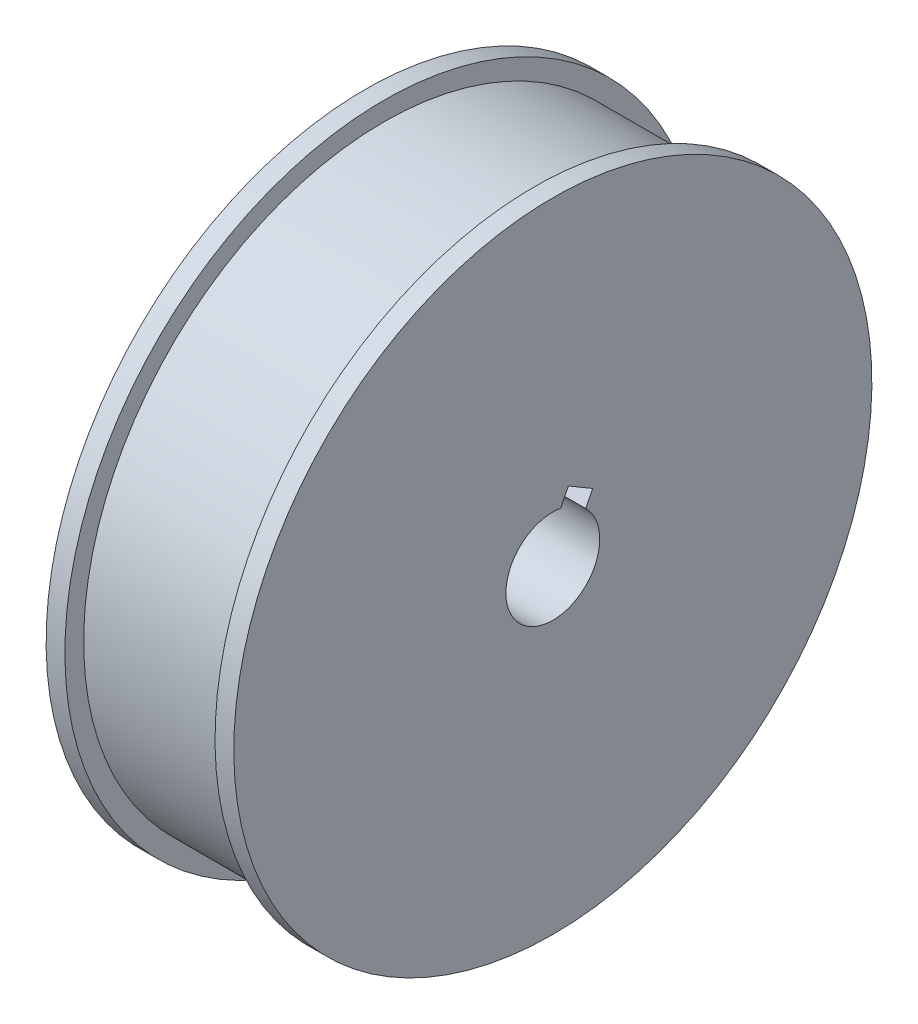
ISO-10303-21;
HEADER;
FILE_DESCRIPTION(('STEP AP214'),'2;1');
FILE_NAME('part.step','',(''),(''),'','','');
FILE_SCHEMA(('AUTOMOTIVE_DESIGN { 1 0 10303 214 1 1 1 1 }'));
ENDSEC;
DATA;
#1=APPLICATION_CONTEXT('core data for automotive mechanical design processes');
#2=APPLICATION_PROTOCOL_DEFINITION('international standard','automotive_design',2000,#1);
#3=PRODUCT_CONTEXT('',#1,'mechanical');
#4=PRODUCT('Part','Part','',(#3));
#5=PRODUCT_RELATED_PRODUCT_CATEGORY('part','',(#4));
#6=PRODUCT_DEFINITION_FORMATION('','',#4);
#7=PRODUCT_DEFINITION_CONTEXT('part definition',#1,'design');
#8=PRODUCT_DEFINITION('design','',#6,#7);
#9=PRODUCT_DEFINITION_SHAPE('','',#8);
#10=(LENGTH_UNIT() NAMED_UNIT(*) SI_UNIT(.MILLI.,.METRE.));
#11=(NAMED_UNIT(*) PLANE_ANGLE_UNIT() SI_UNIT($,.RADIAN.));
#12=(NAMED_UNIT(*) SI_UNIT($,.STERADIAN.) SOLID_ANGLE_UNIT());
#13=UNCERTAINTY_MEASURE_WITH_UNIT(LENGTH_MEASURE(1.E-05),#10,'distance_accuracy_value','');
#14=(GEOMETRIC_REPRESENTATION_CONTEXT(3) GLOBAL_UNCERTAINTY_ASSIGNED_CONTEXT((#13)) GLOBAL_UNIT_ASSIGNED_CONTEXT((#10,
#11,#12)) REPRESENTATION_CONTEXT('',''));
#15=CARTESIAN_POINT('',(0.,0.,0.));
#16=DIRECTION('',(0.,0.,1.));
#17=DIRECTION('',(1.,0.,0.));
#18=AXIS2_PLACEMENT_3D('',#15,#16,#17);
#19=CARTESIAN_POINT('',(15.875,0.,0.));
#20=DIRECTION('',(-1.,0.,0.));
#21=DIRECTION('',(0.,-1.,0.));
#22=AXIS2_PLACEMENT_3D('',#19,#20,#21);
#23=PLANE('',#22);
#24=DIRECTION('',(0.,0.891213934482908,-0.453583204035923));
#25=VECTOR('',#24,1.);
#26=CARTESIAN_POINT('',(15.875,7.82827103191582,-1.31228003901958));
#27=LINE('',#26,#25);
#28=CARTESIAN_POINT('',(15.875,7.82827103191678,-1.31228003901973));
#29=VERTEX_POINT('',#28);
#30=CARTESIAN_POINT('',(15.875,10.4223950616676,-2.63255909161775));
#31=VERTEX_POINT('',#30);
#32=EDGE_CURVE('E101',#29,#31,#27,.T.);
#33=ORIENTED_EDGE('',*,*,#32,.T.);
#34=DIRECTION('',(0.,-0.506856941129746,-0.862030185798965));
#35=VECTOR('',#34,1.);
#36=CARTESIAN_POINT('',(15.875,10.4223950616676,-2.63255909161775));
#37=LINE('',#36,#35);
#38=CARTESIAN_POINT('',(15.875,8.00402725423075,-6.74556590124801));
#39=VERTEX_POINT('',#38);
#40=EDGE_CURVE('E94',#31,#39,#37,.T.);
#41=ORIENTED_EDGE('',*,*,#40,.T.);
#42=DIRECTION('',(0.,-0.89121393448289,0.453583204035961));
#43=VECTOR('',#42,1.);
#44=CARTESIAN_POINT('',(15.875,8.00402725423075,-6.74556590124801));
#45=LINE('',#44,#43);
#46=CARTESIAN_POINT('',(15.875,5.66808102269639,-5.55668640199527));
#47=VERTEX_POINT('',#46);
#48=EDGE_CURVE('E104',#39,#47,#45,.T.);
#49=ORIENTED_EDGE('',*,*,#48,.T.);
#50=CARTESIAN_POINT('',(15.875,-5.26818817299221E-13,5.33663995873788E-13));
#51=DIRECTION('',(-1.,0.,0.));
#52=DIRECTION('',(0.,-1.,0.));
#53=AXIS2_PLACEMENT_3D('',#50,#51,#52);
#54=CIRCLE('',#53,7.9374999999979);
#55=EDGE_CURVE('E61',#47,#29,#54,.T.);
#56=ORIENTED_EDGE('',*,*,#55,.T.);
#57=EDGE_LOOP('',(#33,#41,#49,#56));
#58=FACE_BOUND('',#57,.T.);
#59=CARTESIAN_POINT('',(15.875,0.,0.));
#60=DIRECTION('',(-1.,0.,0.));
#61=DIRECTION('',(0.,-1.,0.));
#62=AXIS2_PLACEMENT_3D('',#59,#60,#61);
#63=CIRCLE('',#62,53.975);
#64=CARTESIAN_POINT('',(15.875,-53.975,0.));
#65=VERTEX_POINT('',#64);
#66=EDGE_CURVE('E11',#65,#65,#63,.T.);
#67=ORIENTED_EDGE('',*,*,#66,.F.);
#68=EDGE_LOOP('',(#67));
#69=FACE_BOUND('',#68,.T.);
#70=ADVANCED_FACE('F43',(#58,#69),#23,.F.);
#71=CARTESIAN_POINT('',(-15.875,0.,0.));
#72=DIRECTION('',(-1.,0.,0.));
#73=DIRECTION('',(0.,-1.,0.));
#74=AXIS2_PLACEMENT_3D('',#71,#72,#73);
#75=CYLINDRICAL_SURFACE('',#74,53.975);
#76=CARTESIAN_POINT('',(12.7,0.,0.));
#77=DIRECTION('',(-1.,0.,0.));
#78=DIRECTION('',(0.,-1.,0.));
#79=AXIS2_PLACEMENT_3D('',#76,#77,#78);
#80=CIRCLE('',#79,53.975);
#81=CARTESIAN_POINT('',(12.7,-53.975,0.));
#82=VERTEX_POINT('',#81);
#83=EDGE_CURVE('E51',#82,#82,#80,.T.);
#84=ORIENTED_EDGE('',*,*,#83,.F.);
#85=EDGE_LOOP('',(#84));
#86=FACE_BOUND('',#85,.T.);
#87=ORIENTED_EDGE('',*,*,#66,.T.);
#88=EDGE_LOOP('',(#87));
#89=FACE_BOUND('',#88,.T.);
#90=ADVANCED_FACE('F161',(#86,#89),#75,.T.);
#91=CARTESIAN_POINT('',(12.7,0.,0.));
#92=DIRECTION('',(-1.,0.,0.));
#93=DIRECTION('',(0.,-1.,0.));
#94=AXIS2_PLACEMENT_3D('',#91,#92,#93);
#95=PLANE('',#94);
#96=ORIENTED_EDGE('',*,*,#83,.T.);
#97=EDGE_LOOP('',(#96));
#98=FACE_BOUND('',#97,.T.);
#99=CARTESIAN_POINT('',(12.7,0.,0.));
#100=DIRECTION('',(-1.,0.,0.));
#101=DIRECTION('',(0.,-1.,0.));
#102=AXIS2_PLACEMENT_3D('',#99,#100,#101);
#103=CIRCLE('',#102,50.8);
#104=CARTESIAN_POINT('',(12.7,-50.8,0.));
#105=VERTEX_POINT('',#104);
#106=EDGE_CURVE('E151',#105,#105,#103,.T.);
#107=ORIENTED_EDGE('',*,*,#106,.F.);
#108=EDGE_LOOP('',(#107));
#109=FACE_BOUND('',#108,.T.);
#110=ADVANCED_FACE('F158',(#98,#109),#95,.T.);
#111=CARTESIAN_POINT('',(-15.875,0.,0.));
#112=DIRECTION('',(-1.,0.,0.));
#113=DIRECTION('',(0.,-1.,0.));
#114=AXIS2_PLACEMENT_3D('',#111,#112,#113);
#115=CYLINDRICAL_SURFACE('',#114,50.8);
#116=ORIENTED_EDGE('',*,*,#106,.T.);
#117=EDGE_LOOP('',(#116));
#118=FACE_BOUND('',#117,.T.);
#119=CARTESIAN_POINT('',(-12.7,0.,0.));
#120=DIRECTION('',(-1.,0.,0.));
#121=DIRECTION('',(0.,-1.,0.));
#122=AXIS2_PLACEMENT_3D('',#119,#120,#121);
#123=CIRCLE('',#122,50.8);
#124=CARTESIAN_POINT('',(-12.7,-50.8,0.));
#125=VERTEX_POINT('',#124);
#126=EDGE_CURVE('E147',#125,#125,#123,.T.);
#127=ORIENTED_EDGE('',*,*,#126,.F.);
#128=EDGE_LOOP('',(#127));
#129=FACE_BOUND('',#128,.T.);
#130=ADVANCED_FACE('F177',(#118,#129),#115,.T.);
#131=CARTESIAN_POINT('',(-12.7,0.,0.));
#132=DIRECTION('',(-1.,0.,0.));
#133=DIRECTION('',(0.,-1.,0.));
#134=AXIS2_PLACEMENT_3D('',#131,#132,#133);
#135=PLANE('',#134);
#136=CARTESIAN_POINT('',(-12.7,0.,0.));
#137=DIRECTION('',(-1.,0.,0.));
#138=DIRECTION('',(0.,-1.,0.));
#139=AXIS2_PLACEMENT_3D('',#136,#137,#138);
#140=CIRCLE('',#139,53.975);
#141=CARTESIAN_POINT('',(-12.7,-53.975,0.));
#142=VERTEX_POINT('',#141);
#143=EDGE_CURVE('E143',#142,#142,#140,.T.);
#144=ORIENTED_EDGE('',*,*,#143,.F.);
#145=EDGE_LOOP('',(#144));
#146=FACE_BOUND('',#145,.T.);
#147=ORIENTED_EDGE('',*,*,#126,.T.);
#148=EDGE_LOOP('',(#147));
#149=FACE_BOUND('',#148,.T.);
#150=ADVANCED_FACE('F184',(#146,#149),#135,.F.);
#151=CARTESIAN_POINT('',(-15.875,0.,0.));
#152=DIRECTION('',(-1.,0.,0.));
#153=DIRECTION('',(0.,-1.,0.));
#154=AXIS2_PLACEMENT_3D('',#151,#152,#153);
#155=CYLINDRICAL_SURFACE('',#154,53.975);
#156=ORIENTED_EDGE('',*,*,#143,.T.);
#157=EDGE_LOOP('',(#156));
#158=FACE_BOUND('',#157,.T.);
#159=CARTESIAN_POINT('',(-15.875,0.,0.));
#160=DIRECTION('',(-1.,0.,0.));
#161=DIRECTION('',(0.,-1.,0.));
#162=AXIS2_PLACEMENT_3D('',#159,#160,#161);
#163=CIRCLE('',#162,53.975);
#164=CARTESIAN_POINT('',(-15.875,-53.975,0.));
#165=VERTEX_POINT('',#164);
#166=EDGE_CURVE('E134',#165,#165,#163,.T.);
#167=ORIENTED_EDGE('',*,*,#166,.F.);
#168=EDGE_LOOP('',(#167));
#169=FACE_BOUND('',#168,.T.);
#170=ADVANCED_FACE('F191',(#158,#169),#155,.T.);
#171=CARTESIAN_POINT('',(-15.875,0.,0.));
#172=DIRECTION('',(-1.,0.,0.));
#173=DIRECTION('',(0.,-1.,0.));
#174=AXIS2_PLACEMENT_3D('',#171,#172,#173);
#175=PLANE('',#174);
#176=DIRECTION('',(0.,-0.506856941129746,-0.862030185798965));
#177=VECTOR('',#176,1.);
#178=CARTESIAN_POINT('',(-15.875,10.4223950616676,-2.63255909161775));
#179=LINE('',#178,#177);
#180=CARTESIAN_POINT('',(-15.875,10.4223950616676,-2.63255909161775));
#181=VERTEX_POINT('',#180);
#182=CARTESIAN_POINT('',(-15.875,8.00402725423075,-6.74556590124801));
#183=VERTEX_POINT('',#182);
#184=EDGE_CURVE('E72',#181,#183,#179,.T.);
#185=ORIENTED_EDGE('',*,*,#184,.F.);
#186=DIRECTION('',(0.,0.891213934482908,-0.453583204035923));
#187=VECTOR('',#186,1.);
#188=CARTESIAN_POINT('',(-15.875,7.82827103191582,-1.31228003901958));
#189=LINE('',#188,#187);
#190=CARTESIAN_POINT('',(-15.875,7.82827103191677,-1.31228003901973));
#191=VERTEX_POINT('',#190);
#192=EDGE_CURVE('E112',#191,#181,#189,.T.);
#193=ORIENTED_EDGE('',*,*,#192,.F.);
#194=CARTESIAN_POINT('',(-15.875,-5.3265119768016E-13,5.33663995873788E-13));
#195=DIRECTION('',(-1.,0.,0.));
#196=DIRECTION('',(0.,-1.,0.));
#197=AXIS2_PLACEMENT_3D('',#194,#195,#196);
#198=CIRCLE('',#197,7.9374999999979);
#199=CARTESIAN_POINT('',(-15.875,5.66808102269639,-5.55668640199527));
#200=VERTEX_POINT('',#199);
#201=EDGE_CURVE('E118',#200,#191,#198,.T.);
#202=ORIENTED_EDGE('',*,*,#201,.F.);
#203=DIRECTION('',(0.,-0.89121393448289,0.453583204035961));
#204=VECTOR('',#203,1.);
#205=CARTESIAN_POINT('',(-15.875,8.00402725423075,-6.74556590124801));
#206=LINE('',#205,#204);
#207=EDGE_CURVE('E126',#183,#200,#206,.T.);
#208=ORIENTED_EDGE('',*,*,#207,.F.);
#209=EDGE_LOOP('',(#185,#193,#202,#208));
#210=FACE_BOUND('',#209,.T.);
#211=ORIENTED_EDGE('',*,*,#166,.T.);
#212=EDGE_LOOP('',(#211));
#213=FACE_BOUND('',#212,.T.);
#214=ADVANCED_FACE('F198',(#210,#213),#175,.T.);
#215=CARTESIAN_POINT('',(15.875,10.4223950616676,-2.63255909161775));
#216=DIRECTION('',(0.,0.862030185798965,-0.506856941129746));
#217=DIRECTION('',(0.,0.506856941129746,0.862030185798965));
#218=AXIS2_PLACEMENT_3D('',#215,#216,#217);
#219=PLANE('',#218);
#220=ORIENTED_EDGE('',*,*,#184,.T.);
#221=DIRECTION('',(-1.,0.,0.));
#222=VECTOR('',#221,1.);
#223=CARTESIAN_POINT('',(15.875,8.00402725423075,-6.74556590124801));
#224=LINE('',#223,#222);
#225=EDGE_CURVE('E90',#39,#183,#224,.T.);
#226=ORIENTED_EDGE('',*,*,#225,.F.);
#227=ORIENTED_EDGE('',*,*,#40,.F.);
#228=DIRECTION('',(-1.,0.,0.));
#229=VECTOR('',#228,1.);
#230=CARTESIAN_POINT('',(15.875,10.4223950616676,-2.63255909161775));
#231=LINE('',#230,#229);
#232=EDGE_CURVE('E132',#31,#181,#231,.T.);
#233=ORIENTED_EDGE('',*,*,#232,.T.);
#234=EDGE_LOOP('',(#220,#226,#227,#233));
#235=FACE_BOUND('',#234,.T.);
#236=ADVANCED_FACE('F92',(#235),#219,.F.);
#237=CARTESIAN_POINT('',(15.875,7.82827103191582,-1.31228003901958));
#238=DIRECTION('',(0.,0.453583204035923,0.891213934482908));
#239=DIRECTION('',(0.,-0.891213934482909,0.453583204035923));
#240=AXIS2_PLACEMENT_3D('',#237,#238,#239);
#241=PLANE('',#240);
#242=ORIENTED_EDGE('',*,*,#192,.T.);
#243=ORIENTED_EDGE('',*,*,#232,.F.);
#244=ORIENTED_EDGE('',*,*,#32,.F.);
#245=DIRECTION('',(-1.,0.,0.));
#246=VECTOR('',#245,1.);
#247=CARTESIAN_POINT('',(15.875,7.82827103191678,-1.31228003901973));
#248=LINE('',#247,#246);
#249=EDGE_CURVE('E135',#29,#191,#248,.T.);
#250=ORIENTED_EDGE('',*,*,#249,.T.);
#251=EDGE_LOOP('',(#242,#243,#244,#250));
#252=FACE_BOUND('',#251,.T.);
#253=ADVANCED_FACE('F211',(#252),#241,.F.);
#254=CARTESIAN_POINT('',(15.875,-5.26818817299221E-13,5.33663995873788E-13));
#255=DIRECTION('',(-1.,0.,0.));
#256=DIRECTION('',(0.,-1.,0.));
#257=AXIS2_PLACEMENT_3D('',#254,#255,#256);
#258=CYLINDRICAL_SURFACE('',#257,7.9374999999979);
#259=ORIENTED_EDGE('',*,*,#201,.T.);
#260=ORIENTED_EDGE('',*,*,#249,.F.);
#261=ORIENTED_EDGE('',*,*,#55,.F.);
#262=DIRECTION('',(-1.,0.,0.));
#263=VECTOR('',#262,1.);
#264=CARTESIAN_POINT('',(15.875,5.6680810226964,-5.55668640199527));
#265=LINE('',#264,#263);
#266=EDGE_CURVE('E100',#47,#200,#265,.T.);
#267=ORIENTED_EDGE('',*,*,#266,.T.);
#268=EDGE_LOOP('',(#259,#260,#261,#267));
#269=FACE_BOUND('',#268,.T.);
#270=ADVANCED_FACE('F218',(#269),#258,.F.);
#271=CARTESIAN_POINT('',(15.875,8.00402725423075,-6.74556590124801));
#272=DIRECTION('',(0.,-0.453583204035961,-0.89121393448289));
#273=DIRECTION('',(0.,0.89121393448289,-0.453583204035961));
#274=AXIS2_PLACEMENT_3D('',#271,#272,#273);
#275=PLANE('',#274);
#276=ORIENTED_EDGE('',*,*,#207,.T.);
#277=ORIENTED_EDGE('',*,*,#266,.F.);
#278=ORIENTED_EDGE('',*,*,#48,.F.);
#279=ORIENTED_EDGE('',*,*,#225,.T.);
#280=EDGE_LOOP('',(#276,#277,#278,#279));
#281=FACE_BOUND('',#280,.T.);
#282=ADVANCED_FACE('F105',(#281),#275,.F.);
#283=CLOSED_SHELL('',(#70,#90,#110,#130,#150,#170,#214,#236,#253,#270,#282));
#284=MANIFOLD_SOLID_BREP('B2',#283);
#285=ADVANCED_BREP_SHAPE_REPRESENTATION('',(#18,#284),#14);
#286=SHAPE_DEFINITION_REPRESENTATION(#9,#285);
ENDSEC;
END-ISO-10303-21;
